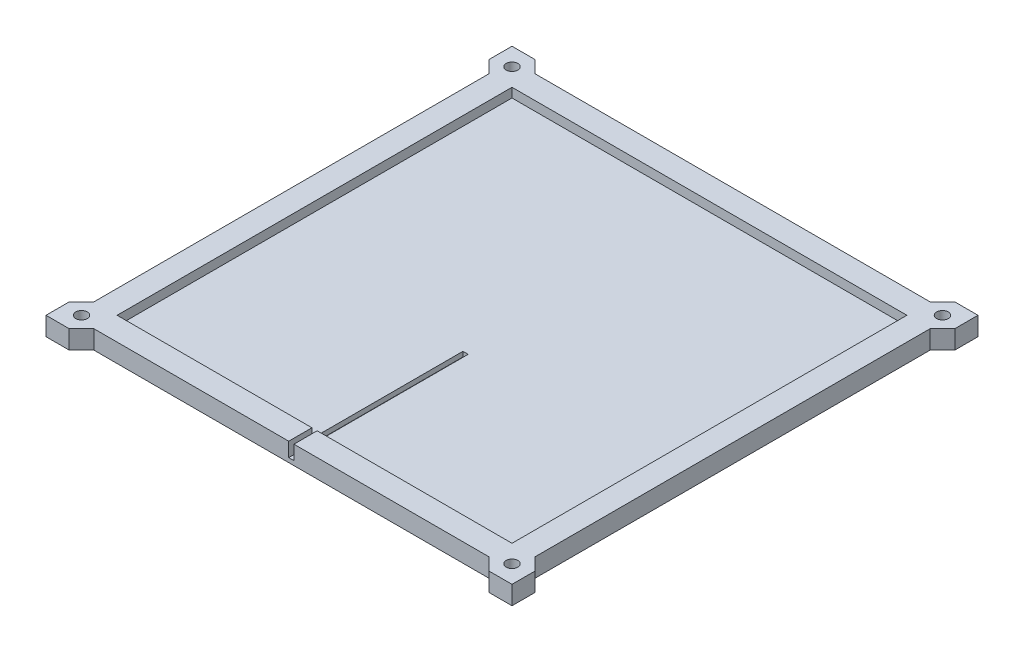
ISO-10303-21;
HEADER;
FILE_DESCRIPTION(('STEP AP214'),'2;1');
FILE_NAME('part.step','',(''),(''),'','','');
FILE_SCHEMA(('AUTOMOTIVE_DESIGN { 1 0 10303 214 1 1 1 1 }'));
ENDSEC;
DATA;
#1=APPLICATION_CONTEXT('core data for automotive mechanical design processes');
#2=APPLICATION_PROTOCOL_DEFINITION('international standard','automotive_design',2000,#1);
#3=PRODUCT_CONTEXT('',#1,'mechanical');
#4=PRODUCT('Part','Part','',(#3));
#5=PRODUCT_RELATED_PRODUCT_CATEGORY('part','',(#4));
#6=PRODUCT_DEFINITION_FORMATION('','',#4);
#7=PRODUCT_DEFINITION_CONTEXT('part definition',#1,'design');
#8=PRODUCT_DEFINITION('design','',#6,#7);
#9=PRODUCT_DEFINITION_SHAPE('','',#8);
#10=(LENGTH_UNIT() NAMED_UNIT(*) SI_UNIT(.MILLI.,.METRE.));
#11=(NAMED_UNIT(*) PLANE_ANGLE_UNIT() SI_UNIT($,.RADIAN.));
#12=(NAMED_UNIT(*) SI_UNIT($,.STERADIAN.) SOLID_ANGLE_UNIT());
#13=UNCERTAINTY_MEASURE_WITH_UNIT(LENGTH_MEASURE(1.E-05),#10,'distance_accuracy_value','');
#14=(GEOMETRIC_REPRESENTATION_CONTEXT(3) GLOBAL_UNCERTAINTY_ASSIGNED_CONTEXT((#13)) GLOBAL_UNIT_ASSIGNED_CONTEXT((#10,
#11,#12)) REPRESENTATION_CONTEXT('',''));
#15=CARTESIAN_POINT('',(0.,0.,0.));
#16=DIRECTION('',(0.,0.,1.));
#17=DIRECTION('',(1.,0.,0.));
#18=AXIS2_PLACEMENT_3D('',#15,#16,#17);
#19=CARTESIAN_POINT('',(-170.,16.,170.));
#20=DIRECTION('',(0.,0.,-1.));
#21=DIRECTION('',(-1.,0.,0.));
#22=AXIS2_PLACEMENT_3D('',#19,#20,#21);
#23=PLANE('',#22);
#24=DIRECTION('',(0.,1.,0.));
#25=VECTOR('',#24,1.);
#26=CARTESIAN_POINT('',(-2.25,15.9999999999999,170.));
#27=LINE('',#26,#25);
#28=CARTESIAN_POINT('',(-2.25000000000002,8.,170.));
#29=VERTEX_POINT('',#28);
#30=CARTESIAN_POINT('',(-2.25,16.,170.));
#31=VERTEX_POINT('',#30);
#32=EDGE_CURVE('E266',#29,#31,#27,.T.);
#33=ORIENTED_EDGE('',*,*,#32,.F.);
#34=DIRECTION('',(1.,0.,0.));
#35=VECTOR('',#34,1.);
#36=CARTESIAN_POINT('',(-170.,8.,170.));
#37=LINE('',#36,#35);
#38=CARTESIAN_POINT('',(-170.,8.,170.));
#39=VERTEX_POINT('',#38);
#40=EDGE_CURVE('E434',#39,#29,#37,.T.);
#41=ORIENTED_EDGE('',*,*,#40,.F.);
#42=DIRECTION('',(0.,-1.,0.));
#43=VECTOR('',#42,1.);
#44=CARTESIAN_POINT('',(-170.,16.,170.));
#45=LINE('',#44,#43);
#46=CARTESIAN_POINT('',(-170.,16.,170.));
#47=VERTEX_POINT('',#46);
#48=EDGE_CURVE('E457',#47,#39,#45,.T.);
#49=ORIENTED_EDGE('',*,*,#48,.F.);
#50=DIRECTION('',(1.,0.,0.));
#51=VECTOR('',#50,1.);
#52=CARTESIAN_POINT('',(-170.,16.,170.));
#53=LINE('',#52,#51);
#54=EDGE_CURVE('E440',#47,#31,#53,.T.);
#55=ORIENTED_EDGE('',*,*,#54,.T.);
#56=EDGE_LOOP('',(#33,#41,#49,#55));
#57=FACE_BOUND('',#56,.T.);
#58=ADVANCED_FACE('F35',(#57),#23,.T.);
#59=CARTESIAN_POINT('',(-190.,8.,190.));
#60=DIRECTION('',(1.,0.,0.));
#61=DIRECTION('',(0.,0.,-1.));
#62=AXIS2_PLACEMENT_3D('',#59,#60,#61);
#63=PLANE('',#62);
#64=DIRECTION('',(0.,1.,0.));
#65=VECTOR('',#64,1.);
#66=CARTESIAN_POINT('',(-190.,-43.2842712474618,170.));
#67=LINE('',#66,#65);
#68=CARTESIAN_POINT('',(-190.,0.,170.));
#69=VERTEX_POINT('',#68);
#70=CARTESIAN_POINT('',(-190.,16.,170.));
#71=VERTEX_POINT('',#70);
#72=EDGE_CURVE('E331',#69,#71,#67,.T.);
#73=ORIENTED_EDGE('',*,*,#72,.T.);
#74=DIRECTION('',(0.,0.,1.));
#75=VECTOR('',#74,1.);
#76=CARTESIAN_POINT('',(-190.,16.,-190.));
#77=LINE('',#76,#75);
#78=CARTESIAN_POINT('',(-190.,16.,-170.));
#79=VERTEX_POINT('',#78);
#80=EDGE_CURVE('E471',#79,#71,#77,.T.);
#81=ORIENTED_EDGE('',*,*,#80,.F.);
#82=DIRECTION('',(0.,1.,0.));
#83=VECTOR('',#82,1.);
#84=CARTESIAN_POINT('',(-190.,-43.2842712474618,-170.));
#85=LINE('',#84,#83);
#86=CARTESIAN_POINT('',(-190.,0.,-170.));
#87=VERTEX_POINT('',#86);
#88=EDGE_CURVE('E410',#87,#79,#85,.T.);
#89=ORIENTED_EDGE('',*,*,#88,.F.);
#90=DIRECTION('',(0.,0.,1.));
#91=VECTOR('',#90,1.);
#92=CARTESIAN_POINT('',(-190.,0.,190.));
#93=LINE('',#92,#91);
#94=EDGE_CURVE('E478',#87,#69,#93,.T.);
#95=ORIENTED_EDGE('',*,*,#94,.T.);
#96=EDGE_LOOP('',(#73,#81,#89,#95));
#97=FACE_BOUND('',#96,.T.);
#98=ADVANCED_FACE('F586',(#97),#63,.F.);
#99=CARTESIAN_POINT('',(-190.,8.,190.));
#100=DIRECTION('',(0.,0.,-1.));
#101=DIRECTION('',(-1.,0.,0.));
#102=AXIS2_PLACEMENT_3D('',#99,#100,#101);
#103=PLANE('',#102);
#104=DIRECTION('',(1.,0.,0.));
#105=VECTOR('',#104,1.);
#106=CARTESIAN_POINT('',(-2.25000000000003,3.75,190.));
#107=LINE('',#106,#105);
#108=CARTESIAN_POINT('',(-2.25000000000003,3.75,190.));
#109=VERTEX_POINT('',#108);
#110=CARTESIAN_POINT('',(2.24999999999999,3.74999999999999,190.));
#111=VERTEX_POINT('',#110);
#112=EDGE_CURVE('E258',#109,#111,#107,.T.);
#113=ORIENTED_EDGE('',*,*,#112,.F.);
#114=DIRECTION('',(0.,-1.,0.));
#115=VECTOR('',#114,1.);
#116=CARTESIAN_POINT('',(-2.25000000000001,33.75,190.));
#117=LINE('',#116,#115);
#118=CARTESIAN_POINT('',(-2.25000000000002,16.,190.));
#119=VERTEX_POINT('',#118);
#120=EDGE_CURVE('E247',#119,#109,#117,.T.);
#121=ORIENTED_EDGE('',*,*,#120,.F.);
#122=DIRECTION('',(1.,0.,0.));
#123=VECTOR('',#122,1.);
#124=CARTESIAN_POINT('',(-190.,16.,190.));
#125=LINE('',#124,#123);
#126=CARTESIAN_POINT('',(-170.,16.,190.));
#127=VERTEX_POINT('',#126);
#128=EDGE_CURVE('E465',#127,#119,#125,.T.);
#129=ORIENTED_EDGE('',*,*,#128,.F.);
#130=DIRECTION('',(0.,1.,0.));
#131=VECTOR('',#130,1.);
#132=CARTESIAN_POINT('',(-170.,-43.2842712474618,190.));
#133=LINE('',#132,#131);
#134=CARTESIAN_POINT('',(-170.,0.,190.));
#135=VERTEX_POINT('',#134);
#136=EDGE_CURVE('E335',#135,#127,#133,.T.);
#137=ORIENTED_EDGE('',*,*,#136,.F.);
#138=DIRECTION('',(1.,0.,0.));
#139=VECTOR('',#138,1.);
#140=CARTESIAN_POINT('',(-190.,0.,190.));
#141=LINE('',#140,#139);
#142=CARTESIAN_POINT('',(170.,0.,190.));
#143=VERTEX_POINT('',#142);
#144=EDGE_CURVE('E481',#135,#143,#141,.T.);
#145=ORIENTED_EDGE('',*,*,#144,.T.);
#146=DIRECTION('',(0.,1.,0.));
#147=VECTOR('',#146,1.);
#148=CARTESIAN_POINT('',(170.,-43.2842712474618,190.));
#149=LINE('',#148,#147);
#150=CARTESIAN_POINT('',(170.,16.,190.));
#151=VERTEX_POINT('',#150);
#152=EDGE_CURVE('E321',#143,#151,#149,.T.);
#153=ORIENTED_EDGE('',*,*,#152,.T.);
#154=CARTESIAN_POINT('',(2.24999999999999,16.,190.));
#155=VERTEX_POINT('',#154);
#156=EDGE_CURVE('E464',#155,#151,#125,.T.);
#157=ORIENTED_EDGE('',*,*,#156,.F.);
#158=DIRECTION('',(0.,1.,0.));
#159=VECTOR('',#158,1.);
#160=CARTESIAN_POINT('',(2.24999999999999,33.75,190.));
#161=LINE('',#160,#159);
#162=EDGE_CURVE('E241',#111,#155,#161,.T.);
#163=ORIENTED_EDGE('',*,*,#162,.F.);
#164=EDGE_LOOP('',(#113,#121,#129,#137,#145,#153,#157,#163));
#165=FACE_BOUND('',#164,.T.);
#166=ADVANCED_FACE('F517',(#165),#103,.F.);
#167=CARTESIAN_POINT('',(190.,8.,190.));
#168=DIRECTION('',(-1.,0.,0.));
#169=DIRECTION('',(0.,0.,1.));
#170=AXIS2_PLACEMENT_3D('',#167,#168,#169);
#171=PLANE('',#170);
#172=DIRECTION('',(0.,0.,-1.));
#173=VECTOR('',#172,1.);
#174=CARTESIAN_POINT('',(190.,16.,190.));
#175=LINE('',#174,#173);
#176=CARTESIAN_POINT('',(190.,16.,170.));
#177=VERTEX_POINT('',#176);
#178=CARTESIAN_POINT('',(190.,16.,-170.));
#179=VERTEX_POINT('',#178);
#180=EDGE_CURVE('E467',#177,#179,#175,.T.);
#181=ORIENTED_EDGE('',*,*,#180,.F.);
#182=DIRECTION('',(0.,1.,0.));
#183=VECTOR('',#182,1.);
#184=CARTESIAN_POINT('',(190.,-43.2842712474618,170.));
#185=LINE('',#184,#183);
#186=CARTESIAN_POINT('',(190.,0.,170.));
#187=VERTEX_POINT('',#186);
#188=EDGE_CURVE('E308',#187,#177,#185,.T.);
#189=ORIENTED_EDGE('',*,*,#188,.F.);
#190=DIRECTION('',(0.,0.,-1.));
#191=VECTOR('',#190,1.);
#192=CARTESIAN_POINT('',(190.,0.,190.));
#193=LINE('',#192,#191);
#194=CARTESIAN_POINT('',(190.,0.,-170.));
#195=VERTEX_POINT('',#194);
#196=EDGE_CURVE('E474',#187,#195,#193,.T.);
#197=ORIENTED_EDGE('',*,*,#196,.T.);
#198=DIRECTION('',(0.,1.,0.));
#199=VECTOR('',#198,1.);
#200=CARTESIAN_POINT('',(190.,-43.2842712474618,-170.));
#201=LINE('',#200,#199);
#202=EDGE_CURVE('E364',#195,#179,#201,.T.);
#203=ORIENTED_EDGE('',*,*,#202,.T.);
#204=EDGE_LOOP('',(#181,#189,#197,#203));
#205=FACE_BOUND('',#204,.T.);
#206=ADVANCED_FACE('F37',(#205),#171,.F.);
#207=CARTESIAN_POINT('',(-190.,8.,-190.));
#208=DIRECTION('',(0.,0.,1.));
#209=DIRECTION('',(1.,0.,0.));
#210=AXIS2_PLACEMENT_3D('',#207,#208,#209);
#211=PLANE('',#210);
#212=DIRECTION('',(0.,1.,0.));
#213=VECTOR('',#212,1.);
#214=CARTESIAN_POINT('',(170.,-43.2842712474618,-190.));
#215=LINE('',#214,#213);
#216=CARTESIAN_POINT('',(170.,0.,-190.));
#217=VERTEX_POINT('',#216);
#218=CARTESIAN_POINT('',(170.,16.,-190.));
#219=VERTEX_POINT('',#218);
#220=EDGE_CURVE('E370',#217,#219,#215,.T.);
#221=ORIENTED_EDGE('',*,*,#220,.F.);
#222=DIRECTION('',(-1.,0.,0.));
#223=VECTOR('',#222,1.);
#224=CARTESIAN_POINT('',(-190.,0.,-190.));
#225=LINE('',#224,#223);
#226=CARTESIAN_POINT('',(-170.,0.,-190.));
#227=VERTEX_POINT('',#226);
#228=EDGE_CURVE('E476',#217,#227,#225,.T.);
#229=ORIENTED_EDGE('',*,*,#228,.T.);
#230=DIRECTION('',(0.,1.,0.));
#231=VECTOR('',#230,1.);
#232=CARTESIAN_POINT('',(-170.,-43.2842712474618,-190.));
#233=LINE('',#232,#231);
#234=CARTESIAN_POINT('',(-170.,16.,-190.));
#235=VERTEX_POINT('',#234);
#236=EDGE_CURVE('E423',#227,#235,#233,.T.);
#237=ORIENTED_EDGE('',*,*,#236,.T.);
#238=DIRECTION('',(-1.,0.,0.));
#239=VECTOR('',#238,1.);
#240=CARTESIAN_POINT('',(190.,16.,-190.));
#241=LINE('',#240,#239);
#242=EDGE_CURVE('E469',#219,#235,#241,.T.);
#243=ORIENTED_EDGE('',*,*,#242,.F.);
#244=EDGE_LOOP('',(#221,#229,#237,#243));
#245=FACE_BOUND('',#244,.T.);
#246=ADVANCED_FACE('F564',(#245),#211,.F.);
#247=CARTESIAN_POINT('',(0.,0.,0.));
#248=DIRECTION('',(0.,-1.,0.));
#249=DIRECTION('',(0.,0.,-1.));
#250=AXIS2_PLACEMENT_3D('',#247,#248,#249);
#251=PLANE('',#250);
#252=CARTESIAN_POINT('',(-185.303300858899,0.,185.303300858899));
#253=DIRECTION('',(0.,-1.,0.));
#254=DIRECTION('',(0.,0.,-1.));
#255=AXIS2_PLACEMENT_3D('',#252,#253,#254);
#256=CIRCLE('',#255,4.99999999999999);
#257=CARTESIAN_POINT('',(-185.303300858899,0.,180.303300858899));
#258=VERTEX_POINT('',#257);
#259=EDGE_CURVE('E282',#258,#258,#256,.F.);
#260=ORIENTED_EDGE('',*,*,#259,.T.);
#261=EDGE_LOOP('',(#260));
#262=FACE_BOUND('',#261,.T.);
#263=CARTESIAN_POINT('',(185.303300858899,0.,185.303300858899));
#264=DIRECTION('',(0.,-1.,0.));
#265=DIRECTION('',(0.,0.,-1.));
#266=AXIS2_PLACEMENT_3D('',#263,#264,#265);
#267=CIRCLE('',#266,4.99999999999999);
#268=CARTESIAN_POINT('',(185.303300858899,0.,180.303300858899));
#269=VERTEX_POINT('',#268);
#270=EDGE_CURVE('E275',#269,#269,#267,.F.);
#271=ORIENTED_EDGE('',*,*,#270,.T.);
#272=EDGE_LOOP('',(#271));
#273=FACE_BOUND('',#272,.T.);
#274=CARTESIAN_POINT('',(185.303300858899,0.,-185.303300858899));
#275=DIRECTION('',(0.,-1.,0.));
#276=DIRECTION('',(0.,0.,-1.));
#277=AXIS2_PLACEMENT_3D('',#274,#275,#276);
#278=CIRCLE('',#277,4.99999999999999);
#279=CARTESIAN_POINT('',(185.303300858899,0.,-190.303300858899));
#280=VERTEX_POINT('',#279);
#281=EDGE_CURVE('E274',#280,#280,#278,.F.);
#282=ORIENTED_EDGE('',*,*,#281,.T.);
#283=EDGE_LOOP('',(#282));
#284=FACE_BOUND('',#283,.T.);
#285=CARTESIAN_POINT('',(-185.303300858899,0.,-185.303300858899));
#286=DIRECTION('',(0.,-1.,0.));
#287=DIRECTION('',(0.,0.,-1.));
#288=AXIS2_PLACEMENT_3D('',#285,#286,#287);
#289=CIRCLE('',#288,4.99999999999999);
#290=CARTESIAN_POINT('',(-185.303300858899,0.,-190.303300858899));
#291=VERTEX_POINT('',#290);
#292=EDGE_CURVE('E291',#291,#291,#289,.F.);
#293=ORIENTED_EDGE('',*,*,#292,.T.);
#294=EDGE_LOOP('',(#293));
#295=FACE_BOUND('',#294,.T.);
#296=ORIENTED_EDGE('',*,*,#196,.F.);
#297=DIRECTION('',(-0.707106781186548,0.,-0.707106781186547));
#298=VECTOR('',#297,1.);
#299=CARTESIAN_POINT('',(9.99999999999977,0.,-9.9999999999998));
#300=LINE('',#299,#298);
#301=CARTESIAN_POINT('',(200.606601717798,0.,180.606601717798));
#302=VERTEX_POINT('',#301);
#303=EDGE_CURVE('E298',#302,#187,#300,.T.);
#304=ORIENTED_EDGE('',*,*,#303,.F.);
#305=DIRECTION('',(0.,0.,-1.));
#306=VECTOR('',#305,1.);
#307=CARTESIAN_POINT('',(200.606601717798,0.,0.));
#308=LINE('',#307,#306);
#309=CARTESIAN_POINT('',(200.606601717798,0.,200.606601717798));
#310=VERTEX_POINT('',#309);
#311=EDGE_CURVE('E309',#310,#302,#308,.T.);
#312=ORIENTED_EDGE('',*,*,#311,.F.);
#313=DIRECTION('',(1.,0.,0.));
#314=VECTOR('',#313,1.);
#315=CARTESIAN_POINT('',(0.,0.,200.606601717798));
#316=LINE('',#315,#314);
#317=CARTESIAN_POINT('',(180.606601717798,0.,200.606601717798));
#318=VERTEX_POINT('',#317);
#319=EDGE_CURVE('E314',#318,#310,#316,.T.);
#320=ORIENTED_EDGE('',*,*,#319,.F.);
#321=DIRECTION('',(0.707106781186549,0.,0.707106781186546));
#322=VECTOR('',#321,1.);
#323=CARTESIAN_POINT('',(-10.0000000000004,0.,10.0000000000004));
#324=LINE('',#323,#322);
#325=EDGE_CURVE('E318',#143,#318,#324,.T.);
#326=ORIENTED_EDGE('',*,*,#325,.F.);
#327=ORIENTED_EDGE('',*,*,#144,.F.);
#328=DIRECTION('',(-0.707106781186549,0.,0.707106781186546));
#329=VECTOR('',#328,1.);
#330=CARTESIAN_POINT('',(10.0000000000004,0.,10.0000000000004));
#331=LINE('',#330,#329);
#332=CARTESIAN_POINT('',(-180.606601717798,0.,200.606601717798));
#333=VERTEX_POINT('',#332);
#334=EDGE_CURVE('E343',#135,#333,#331,.T.);
#335=ORIENTED_EDGE('',*,*,#334,.T.);
#336=DIRECTION('',(-1.,0.,0.));
#337=VECTOR('',#336,1.);
#338=CARTESIAN_POINT('',(0.,0.,200.606601717798));
#339=LINE('',#338,#337);
#340=CARTESIAN_POINT('',(-200.606601717798,0.,200.606601717798));
#341=VERTEX_POINT('',#340);
#342=EDGE_CURVE('E339',#333,#341,#339,.T.);
#343=ORIENTED_EDGE('',*,*,#342,.T.);
#344=DIRECTION('',(0.,0.,-1.));
#345=VECTOR('',#344,1.);
#346=CARTESIAN_POINT('',(-200.606601717798,0.,0.));
#347=LINE('',#346,#345);
#348=CARTESIAN_POINT('',(-200.606601717798,0.,180.606601717798));
#349=VERTEX_POINT('',#348);
#350=EDGE_CURVE('E350',#341,#349,#347,.T.);
#351=ORIENTED_EDGE('',*,*,#350,.T.);
#352=DIRECTION('',(0.707106781186548,0.,-0.707106781186547));
#353=VECTOR('',#352,1.);
#354=CARTESIAN_POINT('',(-9.99999999999977,0.,-9.9999999999998));
#355=LINE('',#354,#353);
#356=EDGE_CURVE('E347',#349,#69,#355,.T.);
#357=ORIENTED_EDGE('',*,*,#356,.T.);
#358=ORIENTED_EDGE('',*,*,#94,.F.);
#359=DIRECTION('',(0.707106781186548,0.,0.707106781186547));
#360=VECTOR('',#359,1.);
#361=CARTESIAN_POINT('',(-9.99999999999977,0.,9.9999999999998));
#362=LINE('',#361,#360);
#363=CARTESIAN_POINT('',(-200.606601717798,0.,-180.606601717798));
#364=VERTEX_POINT('',#363);
#365=EDGE_CURVE('E400',#364,#87,#362,.T.);
#366=ORIENTED_EDGE('',*,*,#365,.F.);
#367=DIRECTION('',(0.,0.,1.));
#368=VECTOR('',#367,1.);
#369=CARTESIAN_POINT('',(-200.606601717798,0.,0.));
#370=LINE('',#369,#368);
#371=CARTESIAN_POINT('',(-200.606601717798,0.,-200.606601717798));
#372=VERTEX_POINT('',#371);
#373=EDGE_CURVE('E411',#372,#364,#370,.T.);
#374=ORIENTED_EDGE('',*,*,#373,.F.);
#375=DIRECTION('',(-1.,0.,0.));
#376=VECTOR('',#375,1.);
#377=CARTESIAN_POINT('',(0.,0.,-200.606601717798));
#378=LINE('',#377,#376);
#379=CARTESIAN_POINT('',(-180.606601717798,0.,-200.606601717798));
#380=VERTEX_POINT('',#379);
#381=EDGE_CURVE('E416',#380,#372,#378,.T.);
#382=ORIENTED_EDGE('',*,*,#381,.F.);
#383=DIRECTION('',(-0.707106781186549,0.,-0.707106781186546));
#384=VECTOR('',#383,1.);
#385=CARTESIAN_POINT('',(10.0000000000004,0.,-10.0000000000004));
#386=LINE('',#385,#384);
#387=EDGE_CURVE('E420',#227,#380,#386,.T.);
#388=ORIENTED_EDGE('',*,*,#387,.F.);
#389=ORIENTED_EDGE('',*,*,#228,.F.);
#390=DIRECTION('',(0.707106781186549,0.,-0.707106781186546));
#391=VECTOR('',#390,1.);
#392=CARTESIAN_POINT('',(-10.0000000000004,0.,-10.0000000000004));
#393=LINE('',#392,#391);
#394=CARTESIAN_POINT('',(180.606601717798,0.,-200.606601717798));
#395=VERTEX_POINT('',#394);
#396=EDGE_CURVE('E378',#217,#395,#393,.T.);
#397=ORIENTED_EDGE('',*,*,#396,.T.);
#398=DIRECTION('',(1.,0.,0.));
#399=VECTOR('',#398,1.);
#400=CARTESIAN_POINT('',(0.,0.,-200.606601717798));
#401=LINE('',#400,#399);
#402=CARTESIAN_POINT('',(200.606601717798,0.,-200.606601717798));
#403=VERTEX_POINT('',#402);
#404=EDGE_CURVE('E374',#395,#403,#401,.T.);
#405=ORIENTED_EDGE('',*,*,#404,.T.);
#406=DIRECTION('',(0.,0.,1.));
#407=VECTOR('',#406,1.);
#408=CARTESIAN_POINT('',(200.606601717798,0.,0.));
#409=LINE('',#408,#407);
#410=CARTESIAN_POINT('',(200.606601717798,0.,-180.606601717798));
#411=VERTEX_POINT('',#410);
#412=EDGE_CURVE('E385',#403,#411,#409,.T.);
#413=ORIENTED_EDGE('',*,*,#412,.T.);
#414=DIRECTION('',(-0.707106781186548,0.,0.707106781186547));
#415=VECTOR('',#414,1.);
#416=CARTESIAN_POINT('',(9.99999999999977,0.,9.9999999999998));
#417=LINE('',#416,#415);
#418=EDGE_CURVE('E382',#411,#195,#417,.T.);
#419=ORIENTED_EDGE('',*,*,#418,.T.);
#420=EDGE_LOOP('',(#296,#304,#312,#320,#326,#327,#335,#343,#351,#357,#358,#366,#374,#382,#388,
#389,#397,#405,#413,#419));
#421=FACE_BOUND('',#420,.T.);
#422=ADVANCED_FACE('F531',(#262,#273,#284,#295,#421),#251,.T.);
#423=CARTESIAN_POINT('',(0.,16.,0.));
#424=DIRECTION('',(0.,1.,0.));
#425=DIRECTION('',(0.,0.,1.));
#426=AXIS2_PLACEMENT_3D('',#423,#424,#425);
#427=PLANE('',#426);
#428=DIRECTION('',(0.,0.,1.));
#429=VECTOR('',#428,1.);
#430=CARTESIAN_POINT('',(-2.25000000000002,16.,0.));
#431=LINE('',#430,#429);
#432=EDGE_CURVE('E268',#31,#119,#431,.T.);
#433=ORIENTED_EDGE('',*,*,#432,.F.);
#434=ORIENTED_EDGE('',*,*,#54,.F.);
#435=DIRECTION('',(0.,0.,1.));
#436=VECTOR('',#435,1.);
#437=CARTESIAN_POINT('',(-170.,16.,-170.));
#438=LINE('',#437,#436);
#439=CARTESIAN_POINT('',(-170.,16.,-170.));
#440=VERTEX_POINT('',#439);
#441=EDGE_CURVE('E436',#440,#47,#438,.T.);
#442=ORIENTED_EDGE('',*,*,#441,.F.);
#443=DIRECTION('',(-1.,0.,0.));
#444=VECTOR('',#443,1.);
#445=CARTESIAN_POINT('',(170.,16.,-170.));
#446=LINE('',#445,#444);
#447=CARTESIAN_POINT('',(170.,16.,-170.));
#448=VERTEX_POINT('',#447);
#449=EDGE_CURVE('E433',#448,#440,#446,.T.);
#450=ORIENTED_EDGE('',*,*,#449,.F.);
#451=DIRECTION('',(0.,0.,-1.));
#452=VECTOR('',#451,1.);
#453=CARTESIAN_POINT('',(170.,16.,170.));
#454=LINE('',#453,#452);
#455=CARTESIAN_POINT('',(170.,16.,170.));
#456=VERTEX_POINT('',#455);
#457=EDGE_CURVE('E431',#456,#448,#454,.T.);
#458=ORIENTED_EDGE('',*,*,#457,.F.);
#459=CARTESIAN_POINT('',(2.25,16.,170.));
#460=VERTEX_POINT('',#459);
#461=EDGE_CURVE('E439',#460,#456,#53,.T.);
#462=ORIENTED_EDGE('',*,*,#461,.F.);
#463=DIRECTION('',(0.,0.,-1.));
#464=VECTOR('',#463,1.);
#465=CARTESIAN_POINT('',(2.24999999999999,16.,0.));
#466=LINE('',#465,#464);
#467=EDGE_CURVE('E264',#155,#460,#466,.T.);
#468=ORIENTED_EDGE('',*,*,#467,.F.);
#469=ORIENTED_EDGE('',*,*,#156,.T.);
#470=DIRECTION('',(0.707106781186549,0.,0.707106781186546));
#471=VECTOR('',#470,1.);
#472=CARTESIAN_POINT('',(-10.0000000000004,16.,10.0000000000004));
#473=LINE('',#472,#471);
#474=CARTESIAN_POINT('',(180.606601717798,16.,200.606601717798));
#475=VERTEX_POINT('',#474);
#476=EDGE_CURVE('E299',#151,#475,#473,.T.);
#477=ORIENTED_EDGE('',*,*,#476,.T.);
#478=DIRECTION('',(1.,0.,0.));
#479=VECTOR('',#478,1.);
#480=CARTESIAN_POINT('',(0.,16.,200.606601717798));
#481=LINE('',#480,#479);
#482=CARTESIAN_POINT('',(200.606601717798,16.,200.606601717798));
#483=VERTEX_POINT('',#482);
#484=EDGE_CURVE('E295',#475,#483,#481,.T.);
#485=ORIENTED_EDGE('',*,*,#484,.T.);
#486=DIRECTION('',(0.,0.,-1.));
#487=VECTOR('',#486,1.);
#488=CARTESIAN_POINT('',(200.606601717798,16.,0.));
#489=LINE('',#488,#487);
#490=CARTESIAN_POINT('',(200.606601717798,16.,180.606601717798));
#491=VERTEX_POINT('',#490);
#492=EDGE_CURVE('E294',#483,#491,#489,.T.);
#493=ORIENTED_EDGE('',*,*,#492,.T.);
#494=DIRECTION('',(-0.707106781186548,0.,-0.707106781186547));
#495=VECTOR('',#494,1.);
#496=CARTESIAN_POINT('',(9.99999999999977,16.,-9.9999999999998));
#497=LINE('',#496,#495);
#498=EDGE_CURVE('E302',#491,#177,#497,.T.);
#499=ORIENTED_EDGE('',*,*,#498,.T.);
#500=ORIENTED_EDGE('',*,*,#180,.T.);
#501=DIRECTION('',(-0.707106781186548,0.,0.707106781186547));
#502=VECTOR('',#501,1.);
#503=CARTESIAN_POINT('',(9.99999999999977,16.,9.9999999999998));
#504=LINE('',#503,#502);
#505=CARTESIAN_POINT('',(200.606601717798,16.,-180.606601717798));
#506=VERTEX_POINT('',#505);
#507=EDGE_CURVE('E361',#506,#179,#504,.T.);
#508=ORIENTED_EDGE('',*,*,#507,.F.);
#509=DIRECTION('',(0.,0.,1.));
#510=VECTOR('',#509,1.);
#511=CARTESIAN_POINT('',(200.606601717798,16.,0.));
#512=LINE('',#511,#510);
#513=CARTESIAN_POINT('',(200.606601717798,16.,-200.606601717798));
#514=VERTEX_POINT('',#513);
#515=EDGE_CURVE('E375',#514,#506,#512,.T.);
#516=ORIENTED_EDGE('',*,*,#515,.F.);
#517=DIRECTION('',(1.,0.,0.));
#518=VECTOR('',#517,1.);
#519=CARTESIAN_POINT('',(0.,16.,-200.606601717798));
#520=LINE('',#519,#518);
#521=CARTESIAN_POINT('',(180.606601717798,16.,-200.606601717798));
#522=VERTEX_POINT('',#521);
#523=EDGE_CURVE('E371',#522,#514,#520,.T.);
#524=ORIENTED_EDGE('',*,*,#523,.F.);
#525=DIRECTION('',(0.707106781186549,0.,-0.707106781186546));
#526=VECTOR('',#525,1.);
#527=CARTESIAN_POINT('',(-10.0000000000004,16.,-10.0000000000004));
#528=LINE('',#527,#526);
#529=EDGE_CURVE('E366',#219,#522,#528,.T.);
#530=ORIENTED_EDGE('',*,*,#529,.F.);
#531=ORIENTED_EDGE('',*,*,#242,.T.);
#532=DIRECTION('',(-0.707106781186549,0.,-0.707106781186546));
#533=VECTOR('',#532,1.);
#534=CARTESIAN_POINT('',(10.0000000000004,16.,-10.0000000000004));
#535=LINE('',#534,#533);
#536=CARTESIAN_POINT('',(-180.606601717798,16.,-200.606601717798));
#537=VERTEX_POINT('',#536);
#538=EDGE_CURVE('E401',#235,#537,#535,.T.);
#539=ORIENTED_EDGE('',*,*,#538,.T.);
#540=DIRECTION('',(-1.,0.,0.));
#541=VECTOR('',#540,1.);
#542=CARTESIAN_POINT('',(0.,16.,-200.606601717798));
#543=LINE('',#542,#541);
#544=CARTESIAN_POINT('',(-200.606601717798,16.,-200.606601717798));
#545=VERTEX_POINT('',#544);
#546=EDGE_CURVE('E397',#537,#545,#543,.T.);
#547=ORIENTED_EDGE('',*,*,#546,.T.);
#548=DIRECTION('',(0.,0.,1.));
#549=VECTOR('',#548,1.);
#550=CARTESIAN_POINT('',(-200.606601717798,16.,0.));
#551=LINE('',#550,#549);
#552=CARTESIAN_POINT('',(-200.606601717798,16.,-180.606601717798));
#553=VERTEX_POINT('',#552);
#554=EDGE_CURVE('E381',#545,#553,#551,.T.);
#555=ORIENTED_EDGE('',*,*,#554,.T.);
#556=DIRECTION('',(0.707106781186548,0.,0.707106781186547));
#557=VECTOR('',#556,1.);
#558=CARTESIAN_POINT('',(-9.99999999999977,16.,9.9999999999998));
#559=LINE('',#558,#557);
#560=EDGE_CURVE('E404',#553,#79,#559,.T.);
#561=ORIENTED_EDGE('',*,*,#560,.T.);
#562=ORIENTED_EDGE('',*,*,#80,.T.);
#563=DIRECTION('',(0.707106781186548,0.,-0.707106781186547));
#564=VECTOR('',#563,1.);
#565=CARTESIAN_POINT('',(-9.99999999999977,16.,-9.9999999999998));
#566=LINE('',#565,#564);
#567=CARTESIAN_POINT('',(-200.606601717798,16.,180.606601717798));
#568=VERTEX_POINT('',#567);
#569=EDGE_CURVE('E329',#568,#71,#566,.T.);
#570=ORIENTED_EDGE('',*,*,#569,.F.);
#571=DIRECTION('',(0.,0.,-1.));
#572=VECTOR('',#571,1.);
#573=CARTESIAN_POINT('',(-200.606601717798,16.,0.));
#574=LINE('',#573,#572);
#575=CARTESIAN_POINT('',(-200.606601717798,16.,200.606601717798));
#576=VERTEX_POINT('',#575);
#577=EDGE_CURVE('E340',#576,#568,#574,.T.);
#578=ORIENTED_EDGE('',*,*,#577,.F.);
#579=DIRECTION('',(-1.,0.,0.));
#580=VECTOR('',#579,1.);
#581=CARTESIAN_POINT('',(0.,16.,200.606601717798));
#582=LINE('',#581,#580);
#583=CARTESIAN_POINT('',(-180.606601717798,16.,200.606601717798));
#584=VERTEX_POINT('',#583);
#585=EDGE_CURVE('E336',#584,#576,#582,.T.);
#586=ORIENTED_EDGE('',*,*,#585,.F.);
#587=DIRECTION('',(-0.707106781186549,0.,0.707106781186546));
#588=VECTOR('',#587,1.);
#589=CARTESIAN_POINT('',(10.0000000000004,16.,10.0000000000004));
#590=LINE('',#589,#588);
#591=EDGE_CURVE('E58',#127,#584,#590,.T.);
#592=ORIENTED_EDGE('',*,*,#591,.F.);
#593=ORIENTED_EDGE('',*,*,#128,.T.);
#594=EDGE_LOOP('',(#433,#434,#442,#450,#458,#462,#468,#469,#477,#485,#493,#499,#500,#508,#516,
#524,#530,#531,#539,#547,#555,#561,#562,#570,#578,#586,#592,#593));
#595=FACE_BOUND('',#594,.T.);
#596=CARTESIAN_POINT('',(-185.303300858899,16.,185.303300858899));
#597=DIRECTION('',(0.,1.,0.));
#598=DIRECTION('',(0.,0.,-1.));
#599=AXIS2_PLACEMENT_3D('',#596,#597,#598);
#600=CIRCLE('',#599,4.99999999999999);
#601=CARTESIAN_POINT('',(-185.303300858899,16.,180.303300858899));
#602=VERTEX_POINT('',#601);
#603=EDGE_CURVE('E270',#602,#602,#600,.T.);
#604=ORIENTED_EDGE('',*,*,#603,.F.);
#605=EDGE_LOOP('',(#604));
#606=FACE_BOUND('',#605,.T.);
#607=CARTESIAN_POINT('',(185.303300858899,16.,185.303300858899));
#608=DIRECTION('',(0.,1.,0.));
#609=DIRECTION('',(0.,0.,1.));
#610=AXIS2_PLACEMENT_3D('',#607,#608,#609);
#611=CIRCLE('',#610,4.99999999999999);
#612=CARTESIAN_POINT('',(185.303300858899,16.,190.303300858899));
#613=VERTEX_POINT('',#612);
#614=EDGE_CURVE('E279',#613,#613,#611,.T.);
#615=ORIENTED_EDGE('',*,*,#614,.F.);
#616=EDGE_LOOP('',(#615));
#617=FACE_BOUND('',#616,.T.);
#618=CARTESIAN_POINT('',(185.303300858899,16.,-185.303300858899));
#619=DIRECTION('',(0.,1.,0.));
#620=DIRECTION('',(0.,0.,-1.));
#621=AXIS2_PLACEMENT_3D('',#618,#619,#620);
#622=CIRCLE('',#621,4.99999999999999);
#623=CARTESIAN_POINT('',(185.303300858899,16.,-190.303300858899));
#624=VERTEX_POINT('',#623);
#625=EDGE_CURVE('E271',#624,#624,#622,.T.);
#626=ORIENTED_EDGE('',*,*,#625,.F.);
#627=EDGE_LOOP('',(#626));
#628=FACE_BOUND('',#627,.T.);
#629=CARTESIAN_POINT('',(-185.303300858899,16.,-185.303300858899));
#630=DIRECTION('',(0.,1.,0.));
#631=DIRECTION('',(0.,0.,1.));
#632=AXIS2_PLACEMENT_3D('',#629,#630,#631);
#633=CIRCLE('',#632,4.99999999999999);
#634=CARTESIAN_POINT('',(-185.303300858899,16.,-180.303300858899));
#635=VERTEX_POINT('',#634);
#636=EDGE_CURVE('E278',#635,#635,#633,.T.);
#637=ORIENTED_EDGE('',*,*,#636,.F.);
#638=EDGE_LOOP('',(#637));
#639=FACE_BOUND('',#638,.T.);
#640=ADVANCED_FACE('F512',(#595,#606,#617,#628,#639),#427,.T.);
#641=CARTESIAN_POINT('',(170.,16.,170.));
#642=DIRECTION('',(-1.,0.,0.));
#643=DIRECTION('',(0.,0.,1.));
#644=AXIS2_PLACEMENT_3D('',#641,#642,#643);
#645=PLANE('',#644);
#646=DIRECTION('',(0.,0.,-1.));
#647=VECTOR('',#646,1.);
#648=CARTESIAN_POINT('',(170.,8.,170.));
#649=LINE('',#648,#647);
#650=CARTESIAN_POINT('',(170.,8.,170.));
#651=VERTEX_POINT('',#650);
#652=CARTESIAN_POINT('',(170.,8.,-170.));
#653=VERTEX_POINT('',#652);
#654=EDGE_CURVE('E430',#651,#653,#649,.T.);
#655=ORIENTED_EDGE('',*,*,#654,.F.);
#656=DIRECTION('',(0.,-1.,0.));
#657=VECTOR('',#656,1.);
#658=CARTESIAN_POINT('',(170.,16.,170.));
#659=LINE('',#658,#657);
#660=EDGE_CURVE('E443',#456,#651,#659,.T.);
#661=ORIENTED_EDGE('',*,*,#660,.F.);
#662=ORIENTED_EDGE('',*,*,#457,.T.);
#663=DIRECTION('',(0.,-1.,0.));
#664=VECTOR('',#663,1.);
#665=CARTESIAN_POINT('',(170.,16.,-170.));
#666=LINE('',#665,#664);
#667=EDGE_CURVE('E461',#448,#653,#666,.T.);
#668=ORIENTED_EDGE('',*,*,#667,.T.);
#669=EDGE_LOOP('',(#655,#661,#662,#668));
#670=FACE_BOUND('',#669,.T.);
#671=ADVANCED_FACE('F497',(#670),#645,.T.);
#672=CARTESIAN_POINT('',(170.,16.,-170.));
#673=DIRECTION('',(0.,0.,1.));
#674=DIRECTION('',(1.,0.,0.));
#675=AXIS2_PLACEMENT_3D('',#672,#673,#674);
#676=PLANE('',#675);
#677=DIRECTION('',(-1.,0.,0.));
#678=VECTOR('',#677,1.);
#679=CARTESIAN_POINT('',(170.,8.,-170.));
#680=LINE('',#679,#678);
#681=CARTESIAN_POINT('',(-170.,8.,-170.));
#682=VERTEX_POINT('',#681);
#683=EDGE_CURVE('E446',#653,#682,#680,.T.);
#684=ORIENTED_EDGE('',*,*,#683,.F.);
#685=ORIENTED_EDGE('',*,*,#667,.F.);
#686=ORIENTED_EDGE('',*,*,#449,.T.);
#687=DIRECTION('',(0.,-1.,0.));
#688=VECTOR('',#687,1.);
#689=CARTESIAN_POINT('',(-170.,16.,-170.));
#690=LINE('',#689,#688);
#691=EDGE_CURVE('E459',#440,#682,#690,.T.);
#692=ORIENTED_EDGE('',*,*,#691,.T.);
#693=EDGE_LOOP('',(#684,#685,#686,#692));
#694=FACE_BOUND('',#693,.T.);
#695=ADVANCED_FACE('F501',(#694),#676,.T.);
#696=CARTESIAN_POINT('',(-170.,16.,-170.));
#697=DIRECTION('',(1.,0.,0.));
#698=DIRECTION('',(0.,0.,-1.));
#699=AXIS2_PLACEMENT_3D('',#696,#697,#698);
#700=PLANE('',#699);
#701=DIRECTION('',(0.,0.,1.));
#702=VECTOR('',#701,1.);
#703=CARTESIAN_POINT('',(-170.,8.,-170.));
#704=LINE('',#703,#702);
#705=EDGE_CURVE('E449',#682,#39,#704,.T.);
#706=ORIENTED_EDGE('',*,*,#705,.F.);
#707=ORIENTED_EDGE('',*,*,#691,.F.);
#708=ORIENTED_EDGE('',*,*,#441,.T.);
#709=ORIENTED_EDGE('',*,*,#48,.T.);
#710=EDGE_LOOP('',(#706,#707,#708,#709));
#711=FACE_BOUND('',#710,.T.);
#712=ADVANCED_FACE('F506',(#711),#700,.T.);
#713=DIRECTION('',(0.,-1.,0.));
#714=VECTOR('',#713,1.);
#715=CARTESIAN_POINT('',(2.25,16.,170.));
#716=LINE('',#715,#714);
#717=CARTESIAN_POINT('',(2.24999999999999,8.,170.));
#718=VERTEX_POINT('',#717);
#719=EDGE_CURVE('E261',#460,#718,#716,.T.);
#720=ORIENTED_EDGE('',*,*,#719,.F.);
#721=ORIENTED_EDGE('',*,*,#461,.T.);
#722=ORIENTED_EDGE('',*,*,#660,.T.);
#723=EDGE_CURVE('E452',#718,#651,#37,.T.);
#724=ORIENTED_EDGE('',*,*,#723,.F.);
#725=EDGE_LOOP('',(#720,#721,#722,#724));
#726=FACE_BOUND('',#725,.T.);
#727=ADVANCED_FACE('F491',(#726),#23,.T.);
#728=CARTESIAN_POINT('',(0.,8.,0.));
#729=DIRECTION('',(0.,-1.,0.));
#730=DIRECTION('',(0.,0.,-1.));
#731=AXIS2_PLACEMENT_3D('',#728,#729,#730);
#732=PLANE('',#731);
#733=ORIENTED_EDGE('',*,*,#40,.T.);
#734=DIRECTION('',(0.,0.,-1.));
#735=VECTOR('',#734,1.);
#736=CARTESIAN_POINT('',(-2.25000000000002,8.,0.));
#737=LINE('',#736,#735);
#738=CARTESIAN_POINT('',(-2.25000000000002,8.00000000000001,40.));
#739=VERTEX_POINT('',#738);
#740=EDGE_CURVE('E11',#29,#739,#737,.T.);
#741=ORIENTED_EDGE('',*,*,#740,.T.);
#742=DIRECTION('',(-1.,0.,0.));
#743=VECTOR('',#742,1.);
#744=CARTESIAN_POINT('',(0.,8.,40.));
#745=LINE('',#744,#743);
#746=CARTESIAN_POINT('',(2.24999999999999,8.,40.));
#747=VERTEX_POINT('',#746);
#748=EDGE_CURVE('E239',#747,#739,#745,.T.);
#749=ORIENTED_EDGE('',*,*,#748,.F.);
#750=DIRECTION('',(0.,0.,1.));
#751=VECTOR('',#750,1.);
#752=CARTESIAN_POINT('',(2.24999999999999,8.,0.));
#753=LINE('',#752,#751);
#754=EDGE_CURVE('E43',#747,#718,#753,.T.);
#755=ORIENTED_EDGE('',*,*,#754,.T.);
#756=ORIENTED_EDGE('',*,*,#723,.T.);
#757=ORIENTED_EDGE('',*,*,#654,.T.);
#758=ORIENTED_EDGE('',*,*,#683,.T.);
#759=ORIENTED_EDGE('',*,*,#705,.T.);
#760=EDGE_LOOP('',(#733,#741,#749,#755,#756,#757,#758,#759));
#761=FACE_BOUND('',#760,.T.);
#762=ADVANCED_FACE('F487',(#761),#732,.F.);
#763=CARTESIAN_POINT('',(-9.99999999999977,-43.2842712474618,9.9999999999998));
#764=DIRECTION('',(-0.707106781186547,0.,0.707106781186548));
#765=DIRECTION('',(0.707106781186548,0.,0.707106781186547));
#766=AXIS2_PLACEMENT_3D('',#763,#764,#765);
#767=PLANE('',#766);
#768=DIRECTION('',(0.,1.,0.));
#769=VECTOR('',#768,1.);
#770=CARTESIAN_POINT('',(-200.606601717798,-43.2842712474618,-180.606601717798));
#771=LINE('',#770,#769);
#772=EDGE_CURVE('E414',#364,#553,#771,.T.);
#773=ORIENTED_EDGE('',*,*,#772,.F.);
#774=ORIENTED_EDGE('',*,*,#365,.T.);
#775=ORIENTED_EDGE('',*,*,#88,.T.);
#776=ORIENTED_EDGE('',*,*,#560,.F.);
#777=EDGE_LOOP('',(#773,#774,#775,#776));
#778=FACE_BOUND('',#777,.T.);
#779=ADVANCED_FACE('F582',(#778),#767,.T.);
#780=CARTESIAN_POINT('',(10.0000000000004,-43.2842712474618,-10.0000000000004));
#781=DIRECTION('',(0.707106781186546,0.,-0.707106781186549));
#782=DIRECTION('',(-0.707106781186549,0.,-0.707106781186546));
#783=AXIS2_PLACEMENT_3D('',#780,#781,#782);
#784=PLANE('',#783);
#785=ORIENTED_EDGE('',*,*,#236,.F.);
#786=ORIENTED_EDGE('',*,*,#387,.T.);
#787=DIRECTION('',(0.,1.,0.));
#788=VECTOR('',#787,1.);
#789=CARTESIAN_POINT('',(-180.606601717798,-43.2842712474618,-200.606601717798));
#790=LINE('',#789,#788);
#791=EDGE_CURVE('E419',#380,#537,#790,.T.);
#792=ORIENTED_EDGE('',*,*,#791,.T.);
#793=ORIENTED_EDGE('',*,*,#538,.F.);
#794=EDGE_LOOP('',(#785,#786,#792,#793));
#795=FACE_BOUND('',#794,.T.);
#796=ADVANCED_FACE('F569',(#795),#784,.T.);
#797=CARTESIAN_POINT('',(0.,-43.2842712474618,-200.606601717798));
#798=DIRECTION('',(0.,0.,-1.));
#799=DIRECTION('',(-1.,0.,0.));
#800=AXIS2_PLACEMENT_3D('',#797,#798,#799);
#801=PLANE('',#800);
#802=ORIENTED_EDGE('',*,*,#791,.F.);
#803=ORIENTED_EDGE('',*,*,#381,.T.);
#804=DIRECTION('',(0.,1.,0.));
#805=VECTOR('',#804,1.);
#806=CARTESIAN_POINT('',(-200.606601717798,-43.2842712474618,-200.606601717798));
#807=LINE('',#806,#805);
#808=EDGE_CURVE('E415',#372,#545,#807,.T.);
#809=ORIENTED_EDGE('',*,*,#808,.T.);
#810=ORIENTED_EDGE('',*,*,#546,.F.);
#811=EDGE_LOOP('',(#802,#803,#809,#810));
#812=FACE_BOUND('',#811,.T.);
#813=ADVANCED_FACE('F573',(#812),#801,.T.);
#814=CARTESIAN_POINT('',(-200.606601717798,-43.2842712474618,0.));
#815=DIRECTION('',(-1.,0.,0.));
#816=DIRECTION('',(0.,0.,1.));
#817=AXIS2_PLACEMENT_3D('',#814,#815,#816);
#818=PLANE('',#817);
#819=ORIENTED_EDGE('',*,*,#808,.F.);
#820=ORIENTED_EDGE('',*,*,#373,.T.);
#821=ORIENTED_EDGE('',*,*,#772,.T.);
#822=ORIENTED_EDGE('',*,*,#554,.F.);
#823=EDGE_LOOP('',(#819,#820,#821,#822));
#824=FACE_BOUND('',#823,.T.);
#825=ADVANCED_FACE('F579',(#824),#818,.T.);
#826=CARTESIAN_POINT('',(200.606601717798,-43.2842712474618,0.));
#827=DIRECTION('',(-1.,0.,0.));
#828=DIRECTION('',(0.,0.,1.));
#829=AXIS2_PLACEMENT_3D('',#826,#827,#828);
#830=PLANE('',#829);
#831=ORIENTED_EDGE('',*,*,#412,.F.);
#832=DIRECTION('',(0.,1.,0.));
#833=VECTOR('',#832,1.);
#834=CARTESIAN_POINT('',(200.606601717798,-43.2842712474618,-200.606601717798));
#835=LINE('',#834,#833);
#836=EDGE_CURVE('E346',#403,#514,#835,.T.);
#837=ORIENTED_EDGE('',*,*,#836,.T.);
#838=ORIENTED_EDGE('',*,*,#515,.T.);
#839=DIRECTION('',(0.,1.,0.));
#840=VECTOR('',#839,1.);
#841=CARTESIAN_POINT('',(200.606601717798,-43.2842712474618,-180.606601717798));
#842=LINE('',#841,#840);
#843=EDGE_CURVE('E365',#411,#506,#842,.T.);
#844=ORIENTED_EDGE('',*,*,#843,.F.);
#845=EDGE_LOOP('',(#831,#837,#838,#844));
#846=FACE_BOUND('',#845,.T.);
#847=ADVANCED_FACE('F552',(#846),#830,.F.);
#848=CARTESIAN_POINT('',(9.99999999999977,-43.2842712474618,9.9999999999998));
#849=DIRECTION('',(-0.707106781186547,0.,-0.707106781186548));
#850=DIRECTION('',(-0.707106781186548,0.,0.707106781186547));
#851=AXIS2_PLACEMENT_3D('',#848,#849,#850);
#852=PLANE('',#851);
#853=ORIENTED_EDGE('',*,*,#418,.F.);
#854=ORIENTED_EDGE('',*,*,#843,.T.);
#855=ORIENTED_EDGE('',*,*,#507,.T.);
#856=ORIENTED_EDGE('',*,*,#202,.F.);
#857=EDGE_LOOP('',(#853,#854,#855,#856));
#858=FACE_BOUND('',#857,.T.);
#859=ADVANCED_FACE('F549',(#858),#852,.F.);
#860=CARTESIAN_POINT('',(-10.0000000000004,-43.2842712474618,-10.0000000000004));
#861=DIRECTION('',(0.707106781186546,0.,0.707106781186549));
#862=DIRECTION('',(0.707106781186549,0.,-0.707106781186546));
#863=AXIS2_PLACEMENT_3D('',#860,#861,#862);
#864=PLANE('',#863);
#865=ORIENTED_EDGE('',*,*,#396,.F.);
#866=ORIENTED_EDGE('',*,*,#220,.T.);
#867=ORIENTED_EDGE('',*,*,#529,.T.);
#868=DIRECTION('',(0.,1.,0.));
#869=VECTOR('',#868,1.);
#870=CARTESIAN_POINT('',(180.606601717798,-43.2842712474618,-200.606601717798));
#871=LINE('',#870,#869);
#872=EDGE_CURVE('E369',#395,#522,#871,.T.);
#873=ORIENTED_EDGE('',*,*,#872,.F.);
#874=EDGE_LOOP('',(#865,#866,#867,#873));
#875=FACE_BOUND('',#874,.T.);
#876=ADVANCED_FACE('F559',(#875),#864,.F.);
#877=CARTESIAN_POINT('',(0.,-43.2842712474618,-200.606601717798));
#878=DIRECTION('',(0.,0.,1.));
#879=DIRECTION('',(1.,0.,0.));
#880=AXIS2_PLACEMENT_3D('',#877,#878,#879);
#881=PLANE('',#880);
#882=ORIENTED_EDGE('',*,*,#404,.F.);
#883=ORIENTED_EDGE('',*,*,#872,.T.);
#884=ORIENTED_EDGE('',*,*,#523,.T.);
#885=ORIENTED_EDGE('',*,*,#836,.F.);
#886=EDGE_LOOP('',(#882,#883,#884,#885));
#887=FACE_BOUND('',#886,.T.);
#888=ADVANCED_FACE('F557',(#887),#881,.F.);
#889=CARTESIAN_POINT('',(-200.606601717798,-43.2842712474618,0.));
#890=DIRECTION('',(1.,0.,0.));
#891=DIRECTION('',(0.,0.,-1.));
#892=AXIS2_PLACEMENT_3D('',#889,#890,#891);
#893=PLANE('',#892);
#894=ORIENTED_EDGE('',*,*,#350,.F.);
#895=DIRECTION('',(0.,1.,0.));
#896=VECTOR('',#895,1.);
#897=CARTESIAN_POINT('',(-200.606601717798,-43.2842712474618,200.606601717798));
#898=LINE('',#897,#896);
#899=EDGE_CURVE('E328',#341,#576,#898,.T.);
#900=ORIENTED_EDGE('',*,*,#899,.T.);
#901=ORIENTED_EDGE('',*,*,#577,.T.);
#902=DIRECTION('',(0.,1.,0.));
#903=VECTOR('',#902,1.);
#904=CARTESIAN_POINT('',(-200.606601717798,-43.2842712474618,180.606601717798));
#905=LINE('',#904,#903);
#906=EDGE_CURVE('E332',#349,#568,#905,.T.);
#907=ORIENTED_EDGE('',*,*,#906,.F.);
#908=EDGE_LOOP('',(#894,#900,#901,#907));
#909=FACE_BOUND('',#908,.T.);
#910=ADVANCED_FACE('F593',(#909),#893,.F.);
#911=CARTESIAN_POINT('',(-9.99999999999977,-43.2842712474618,-9.9999999999998));
#912=DIRECTION('',(0.707106781186547,0.,0.707106781186548));
#913=DIRECTION('',(0.707106781186548,0.,-0.707106781186547));
#914=AXIS2_PLACEMENT_3D('',#911,#912,#913);
#915=PLANE('',#914);
#916=ORIENTED_EDGE('',*,*,#356,.F.);
#917=ORIENTED_EDGE('',*,*,#906,.T.);
#918=ORIENTED_EDGE('',*,*,#569,.T.);
#919=ORIENTED_EDGE('',*,*,#72,.F.);
#920=EDGE_LOOP('',(#916,#917,#918,#919));
#921=FACE_BOUND('',#920,.T.);
#922=ADVANCED_FACE('F590',(#921),#915,.F.);
#923=CARTESIAN_POINT('',(10.0000000000004,-43.2842712474618,10.0000000000004));
#924=DIRECTION('',(-0.707106781186546,0.,-0.707106781186549));
#925=DIRECTION('',(-0.707106781186549,0.,0.707106781186546));
#926=AXIS2_PLACEMENT_3D('',#923,#924,#925);
#927=PLANE('',#926);
#928=ORIENTED_EDGE('',*,*,#334,.F.);
#929=ORIENTED_EDGE('',*,*,#136,.T.);
#930=ORIENTED_EDGE('',*,*,#591,.T.);
#931=DIRECTION('',(0.,1.,0.));
#932=VECTOR('',#931,1.);
#933=CARTESIAN_POINT('',(-180.606601717798,-43.2842712474618,200.606601717798));
#934=LINE('',#933,#932);
#935=EDGE_CURVE('E334',#333,#584,#934,.T.);
#936=ORIENTED_EDGE('',*,*,#935,.F.);
#937=EDGE_LOOP('',(#928,#929,#930,#936));
#938=FACE_BOUND('',#937,.T.);
#939=ADVANCED_FACE('F599',(#938),#927,.F.);
#940=CARTESIAN_POINT('',(0.,-43.2842712474618,200.606601717798));
#941=DIRECTION('',(0.,0.,-1.));
#942=DIRECTION('',(-1.,0.,0.));
#943=AXIS2_PLACEMENT_3D('',#940,#941,#942);
#944=PLANE('',#943);
#945=ORIENTED_EDGE('',*,*,#342,.F.);
#946=ORIENTED_EDGE('',*,*,#935,.T.);
#947=ORIENTED_EDGE('',*,*,#585,.T.);
#948=ORIENTED_EDGE('',*,*,#899,.F.);
#949=EDGE_LOOP('',(#945,#946,#947,#948));
#950=FACE_BOUND('',#949,.T.);
#951=ADVANCED_FACE('F597',(#950),#944,.F.);
#952=CARTESIAN_POINT('',(9.99999999999977,-43.2842712474618,-9.9999999999998));
#953=DIRECTION('',(0.707106781186547,0.,-0.707106781186548));
#954=DIRECTION('',(-0.707106781186548,0.,-0.707106781186547));
#955=AXIS2_PLACEMENT_3D('',#952,#953,#954);
#956=PLANE('',#955);
#957=DIRECTION('',(0.,1.,0.));
#958=VECTOR('',#957,1.);
#959=CARTESIAN_POINT('',(200.606601717798,-43.2842712474618,180.606601717798));
#960=LINE('',#959,#958);
#961=EDGE_CURVE('E312',#302,#491,#960,.T.);
#962=ORIENTED_EDGE('',*,*,#961,.F.);
#963=ORIENTED_EDGE('',*,*,#303,.T.);
#964=ORIENTED_EDGE('',*,*,#188,.T.);
#965=ORIENTED_EDGE('',*,*,#498,.F.);
#966=EDGE_LOOP('',(#962,#963,#964,#965));
#967=FACE_BOUND('',#966,.T.);
#968=ADVANCED_FACE('F542',(#967),#956,.T.);
#969=CARTESIAN_POINT('',(-10.0000000000004,-43.2842712474618,10.0000000000004));
#970=DIRECTION('',(-0.707106781186546,0.,0.707106781186549));
#971=DIRECTION('',(0.707106781186549,0.,0.707106781186546));
#972=AXIS2_PLACEMENT_3D('',#969,#970,#971);
#973=PLANE('',#972);
#974=ORIENTED_EDGE('',*,*,#152,.F.);
#975=ORIENTED_EDGE('',*,*,#325,.T.);
#976=DIRECTION('',(0.,1.,0.));
#977=VECTOR('',#976,1.);
#978=CARTESIAN_POINT('',(180.606601717798,-43.2842712474618,200.606601717798));
#979=LINE('',#978,#977);
#980=EDGE_CURVE('E317',#318,#475,#979,.T.);
#981=ORIENTED_EDGE('',*,*,#980,.T.);
#982=ORIENTED_EDGE('',*,*,#476,.F.);
#983=EDGE_LOOP('',(#974,#975,#981,#982));
#984=FACE_BOUND('',#983,.T.);
#985=ADVANCED_FACE('F527',(#984),#973,.T.);
#986=CARTESIAN_POINT('',(0.,-43.2842712474618,200.606601717798));
#987=DIRECTION('',(0.,0.,1.));
#988=DIRECTION('',(1.,0.,0.));
#989=AXIS2_PLACEMENT_3D('',#986,#987,#988);
#990=PLANE('',#989);
#991=ORIENTED_EDGE('',*,*,#980,.F.);
#992=ORIENTED_EDGE('',*,*,#319,.T.);
#993=DIRECTION('',(0.,1.,0.));
#994=VECTOR('',#993,1.);
#995=CARTESIAN_POINT('',(200.606601717798,-43.2842712474618,200.606601717798));
#996=LINE('',#995,#994);
#997=EDGE_CURVE('E313',#310,#483,#996,.T.);
#998=ORIENTED_EDGE('',*,*,#997,.T.);
#999=ORIENTED_EDGE('',*,*,#484,.F.);
#1000=EDGE_LOOP('',(#991,#992,#998,#999));
#1001=FACE_BOUND('',#1000,.T.);
#1002=ADVANCED_FACE('F534',(#1001),#990,.T.);
#1003=CARTESIAN_POINT('',(200.606601717798,-43.2842712474618,0.));
#1004=DIRECTION('',(1.,0.,0.));
#1005=DIRECTION('',(0.,0.,-1.));
#1006=AXIS2_PLACEMENT_3D('',#1003,#1004,#1005);
#1007=PLANE('',#1006);
#1008=ORIENTED_EDGE('',*,*,#997,.F.);
#1009=ORIENTED_EDGE('',*,*,#311,.T.);
#1010=ORIENTED_EDGE('',*,*,#961,.T.);
#1011=ORIENTED_EDGE('',*,*,#492,.F.);
#1012=EDGE_LOOP('',(#1008,#1009,#1010,#1011));
#1013=FACE_BOUND('',#1012,.T.);
#1014=ADVANCED_FACE('F539',(#1013),#1007,.T.);
#1015=CARTESIAN_POINT('',(-185.303300858899,-14.142135623731,-185.303300858899));
#1016=DIRECTION('',(0.,1.,0.));
#1017=DIRECTION('',(0.,0.,1.));
#1018=AXIS2_PLACEMENT_3D('',#1015,#1016,#1017);
#1019=CYLINDRICAL_SURFACE('',#1018,4.99999999999999);
#1020=ORIENTED_EDGE('',*,*,#636,.T.);
#1021=EDGE_LOOP('',(#1020));
#1022=FACE_BOUND('',#1021,.T.);
#1023=ORIENTED_EDGE('',*,*,#292,.F.);
#1024=EDGE_LOOP('',(#1023));
#1025=FACE_BOUND('',#1024,.T.);
#1026=ADVANCED_FACE('F764',(#1022,#1025),#1019,.F.);
#1027=CARTESIAN_POINT('',(185.303300858899,-14.142135623731,-185.303300858899));
#1028=DIRECTION('',(0.,1.,0.));
#1029=DIRECTION('',(0.,0.,1.));
#1030=AXIS2_PLACEMENT_3D('',#1027,#1028,#1029);
#1031=CYLINDRICAL_SURFACE('',#1030,4.99999999999999);
#1032=ORIENTED_EDGE('',*,*,#625,.T.);
#1033=EDGE_LOOP('',(#1032));
#1034=FACE_BOUND('',#1033,.T.);
#1035=ORIENTED_EDGE('',*,*,#281,.F.);
#1036=EDGE_LOOP('',(#1035));
#1037=FACE_BOUND('',#1036,.T.);
#1038=ADVANCED_FACE('F769',(#1034,#1037),#1031,.F.);
#1039=CARTESIAN_POINT('',(185.303300858899,-14.142135623731,185.303300858899));
#1040=DIRECTION('',(0.,1.,0.));
#1041=DIRECTION('',(0.,0.,1.));
#1042=AXIS2_PLACEMENT_3D('',#1039,#1040,#1041);
#1043=CYLINDRICAL_SURFACE('',#1042,4.99999999999999);
#1044=ORIENTED_EDGE('',*,*,#614,.T.);
#1045=EDGE_LOOP('',(#1044));
#1046=FACE_BOUND('',#1045,.T.);
#1047=ORIENTED_EDGE('',*,*,#270,.F.);
#1048=EDGE_LOOP('',(#1047));
#1049=FACE_BOUND('',#1048,.T.);
#1050=ADVANCED_FACE('F779',(#1046,#1049),#1043,.F.);
#1051=CARTESIAN_POINT('',(-185.303300858899,-14.142135623731,185.303300858899));
#1052=DIRECTION('',(0.,1.,0.));
#1053=DIRECTION('',(0.,0.,1.));
#1054=AXIS2_PLACEMENT_3D('',#1051,#1052,#1053);
#1055=CYLINDRICAL_SURFACE('',#1054,4.99999999999999);
#1056=ORIENTED_EDGE('',*,*,#603,.T.);
#1057=EDGE_LOOP('',(#1056));
#1058=FACE_BOUND('',#1057,.T.);
#1059=ORIENTED_EDGE('',*,*,#259,.F.);
#1060=EDGE_LOOP('',(#1059));
#1061=FACE_BOUND('',#1060,.T.);
#1062=ADVANCED_FACE('F789',(#1058,#1061),#1055,.F.);
#1063=CARTESIAN_POINT('',(0.,0.,40.));
#1064=DIRECTION('',(0.,0.,1.));
#1065=DIRECTION('',(1.,0.,0.));
#1066=AXIS2_PLACEMENT_3D('',#1063,#1064,#1065);
#1067=PLANE('',#1066);
#1068=ORIENTED_EDGE('',*,*,#748,.T.);
#1069=DIRECTION('',(0.,-1.,0.));
#1070=VECTOR('',#1069,1.);
#1071=CARTESIAN_POINT('',(-2.25000000000001,33.75,40.));
#1072=LINE('',#1071,#1070);
#1073=CARTESIAN_POINT('',(-2.25000000000003,3.75,40.));
#1074=VERTEX_POINT('',#1073);
#1075=EDGE_CURVE('E233',#739,#1074,#1072,.T.);
#1076=ORIENTED_EDGE('',*,*,#1075,.T.);
#1077=DIRECTION('',(1.,0.,0.));
#1078=VECTOR('',#1077,1.);
#1079=CARTESIAN_POINT('',(-2.25000000000003,3.75,40.));
#1080=LINE('',#1079,#1078);
#1081=CARTESIAN_POINT('',(2.24999999999999,3.74999999999999,40.));
#1082=VERTEX_POINT('',#1081);
#1083=EDGE_CURVE('E237',#1074,#1082,#1080,.T.);
#1084=ORIENTED_EDGE('',*,*,#1083,.T.);
#1085=DIRECTION('',(0.,1.,0.));
#1086=VECTOR('',#1085,1.);
#1087=CARTESIAN_POINT('',(2.24999999999999,33.75,40.));
#1088=LINE('',#1087,#1086);
#1089=EDGE_CURVE('E50',#1082,#747,#1088,.T.);
#1090=ORIENTED_EDGE('',*,*,#1089,.T.);
#1091=EDGE_LOOP('',(#1068,#1076,#1084,#1090));
#1092=FACE_BOUND('',#1091,.T.);
#1093=ADVANCED_FACE('F235',(#1092),#1067,.T.);
#1094=CARTESIAN_POINT('',(-2.25000000000001,33.75,40.));
#1095=DIRECTION('',(-1.,0.,0.));
#1096=DIRECTION('',(0.,-1.,0.));
#1097=AXIS2_PLACEMENT_3D('',#1094,#1095,#1096);
#1098=PLANE('',#1097);
#1099=ORIENTED_EDGE('',*,*,#432,.T.);
#1100=ORIENTED_EDGE('',*,*,#120,.T.);
#1101=DIRECTION('',(0.,0.,1.));
#1102=VECTOR('',#1101,1.);
#1103=CARTESIAN_POINT('',(-2.25000000000003,3.75,40.));
#1104=LINE('',#1103,#1102);
#1105=EDGE_CURVE('E244',#1074,#109,#1104,.T.);
#1106=ORIENTED_EDGE('',*,*,#1105,.F.);
#1107=ORIENTED_EDGE('',*,*,#1075,.F.);
#1108=ORIENTED_EDGE('',*,*,#740,.F.);
#1109=ORIENTED_EDGE('',*,*,#32,.T.);
#1110=EDGE_LOOP('',(#1099,#1100,#1106,#1107,#1108,#1109));
#1111=FACE_BOUND('',#1110,.T.);
#1112=ADVANCED_FACE('F245',(#1111),#1098,.F.);
#1113=CARTESIAN_POINT('',(2.24999999999999,33.75,40.));
#1114=DIRECTION('',(1.,0.,0.));
#1115=DIRECTION('',(0.,1.,0.));
#1116=AXIS2_PLACEMENT_3D('',#1113,#1114,#1115);
#1117=PLANE('',#1116);
#1118=ORIENTED_EDGE('',*,*,#467,.T.);
#1119=ORIENTED_EDGE('',*,*,#719,.T.);
#1120=ORIENTED_EDGE('',*,*,#754,.F.);
#1121=ORIENTED_EDGE('',*,*,#1089,.F.);
#1122=DIRECTION('',(0.,0.,1.));
#1123=VECTOR('',#1122,1.);
#1124=CARTESIAN_POINT('',(2.24999999999999,3.74999999999999,40.));
#1125=LINE('',#1124,#1123);
#1126=EDGE_CURVE('E251',#1082,#111,#1125,.T.);
#1127=ORIENTED_EDGE('',*,*,#1126,.T.);
#1128=ORIENTED_EDGE('',*,*,#162,.T.);
#1129=EDGE_LOOP('',(#1118,#1119,#1120,#1121,#1127,#1128));
#1130=FACE_BOUND('',#1129,.T.);
#1131=ADVANCED_FACE('F522',(#1130),#1117,.F.);
#1132=CARTESIAN_POINT('',(-2.25000000000003,3.75,40.));
#1133=DIRECTION('',(0.,-1.,0.));
#1134=DIRECTION('',(1.,0.,0.));
#1135=AXIS2_PLACEMENT_3D('',#1132,#1133,#1134);
#1136=PLANE('',#1135);
#1137=ORIENTED_EDGE('',*,*,#112,.T.);
#1138=ORIENTED_EDGE('',*,*,#1126,.F.);
#1139=ORIENTED_EDGE('',*,*,#1083,.F.);
#1140=ORIENTED_EDGE('',*,*,#1105,.T.);
#1141=EDGE_LOOP('',(#1137,#1138,#1139,#1140));
#1142=FACE_BOUND('',#1141,.T.);
#1143=ADVANCED_FACE('F253',(#1142),#1136,.F.);
#1144=CLOSED_SHELL('',(#58,#98,#166,#206,#246,#422,#640,#671,#695,#712,#727,#762,#779,#796,#813,
#825,#847,#859,#876,#888,#910,#922,#939,#951,#968,#985,#1002,#1014,#1026,#1038,#1050,#1062,
#1093,#1112,#1131,#1143));
#1145=MANIFOLD_SOLID_BREP('B2',#1144);
#1146=ADVANCED_BREP_SHAPE_REPRESENTATION('',(#18,#1145),#14);
#1147=SHAPE_DEFINITION_REPRESENTATION(#9,#1146);
ENDSEC;
END-ISO-10303-21;
